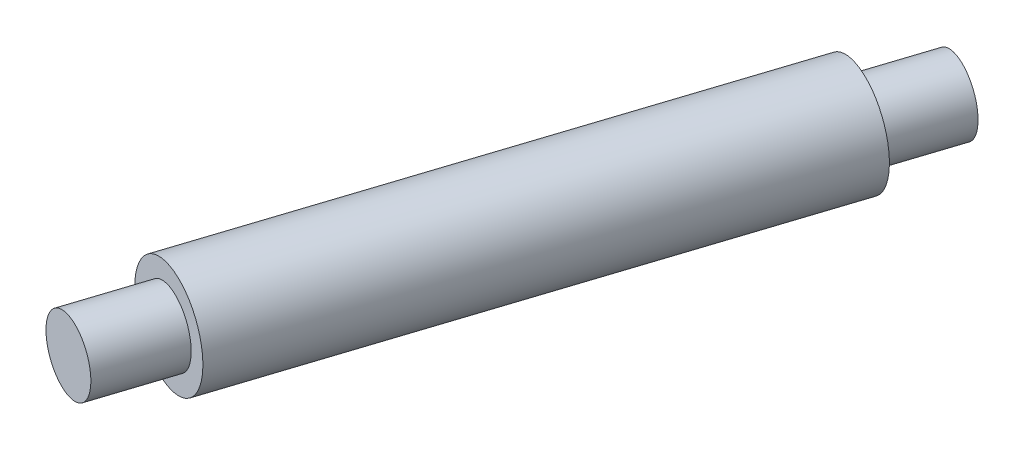
ISO-10303-21;
HEADER;
FILE_DESCRIPTION(('STEP AP214'),'2;1');
FILE_NAME('part.step','',(''),(''),'','','');
FILE_SCHEMA(('AUTOMOTIVE_DESIGN { 1 0 10303 214 1 1 1 1 }'));
ENDSEC;
DATA;
#1=APPLICATION_CONTEXT('core data for automotive mechanical design processes');
#2=APPLICATION_PROTOCOL_DEFINITION('international standard','automotive_design',2000,#1);
#3=PRODUCT_CONTEXT('',#1,'mechanical');
#4=PRODUCT('Part','Part','',(#3));
#5=PRODUCT_RELATED_PRODUCT_CATEGORY('part','',(#4));
#6=PRODUCT_DEFINITION_FORMATION('','',#4);
#7=PRODUCT_DEFINITION_CONTEXT('part definition',#1,'design');
#8=PRODUCT_DEFINITION('design','',#6,#7);
#9=PRODUCT_DEFINITION_SHAPE('','',#8);
#10=(LENGTH_UNIT() NAMED_UNIT(*) SI_UNIT(.MILLI.,.METRE.));
#11=(NAMED_UNIT(*) PLANE_ANGLE_UNIT() SI_UNIT($,.RADIAN.));
#12=(NAMED_UNIT(*) SI_UNIT($,.STERADIAN.) SOLID_ANGLE_UNIT());
#13=UNCERTAINTY_MEASURE_WITH_UNIT(LENGTH_MEASURE(1.E-05),#10,'distance_accuracy_value','');
#14=(GEOMETRIC_REPRESENTATION_CONTEXT(3) GLOBAL_UNCERTAINTY_ASSIGNED_CONTEXT((#13)) GLOBAL_UNIT_ASSIGNED_CONTEXT((#10,
#11,#12)) REPRESENTATION_CONTEXT('',''));
#15=CARTESIAN_POINT('',(0.,0.,0.));
#16=DIRECTION('',(0.,0.,1.));
#17=DIRECTION('',(1.,0.,0.));
#18=AXIS2_PLACEMENT_3D('',#15,#16,#17);
#19=CARTESIAN_POINT('',(-26.59443763107,7.802709104713,4.502221206407));
#20=DIRECTION('',(0.309016994374702,0.,-0.951056516295233));
#21=DIRECTION('',(0.951056516295233,0.,0.309016994374702));
#22=AXIS2_PLACEMENT_3D('',#19,#20,#21);
#23=PLANE('',#22);
#24=CARTESIAN_POINT('',(-25.3580641598791,6.5,4.90394329908783));
#25=DIRECTION('',(0.309016994379564,0.,-0.951056516293654));
#26=DIRECTION('',(-0.951056516293654,0.,-0.309016994379564));
#27=AXIS2_PLACEMENT_3D('',#24,#25,#26);
#28=CIRCLE('',#27,1.24999999999118);
#29=CARTESIAN_POINT('',(-26.5468848052378,6.5,4.5176720561161));
#30=VERTEX_POINT('',#29);
#31=EDGE_CURVE('E19',#30,#30,#28,.F.);
#32=ORIENTED_EDGE('',*,*,#31,.T.);
#33=EDGE_LOOP('',(#32));
#34=FACE_BOUND('',#33,.T.);
#35=ADVANCED_FACE('F15',(#34),#23,.F.);
#36=CARTESIAN_POINT('',(-25.3580641598791,6.5,4.90394329908783));
#37=DIRECTION('',(0.309016994379564,0.,-0.951056516293654));
#38=DIRECTION('',(-0.951056516293654,0.,-0.309016994379564));
#39=AXIS2_PLACEMENT_3D('',#36,#37,#38);
#40=CYLINDRICAL_SURFACE('',#39,1.24999999999118);
#41=CARTESIAN_POINT('',(-24.4773657259011,6.5,2.19343222766236));
#42=DIRECTION('',(0.309016994379564,0.,-0.951056516293654));
#43=DIRECTION('',(-0.951056516293654,0.,-0.309016994379564));
#44=AXIS2_PLACEMENT_3D('',#41,#42,#43);
#45=CIRCLE('',#44,1.24999999999118);
#46=CARTESIAN_POINT('',(-25.6661863712597,6.5,1.80716098469063));
#47=VERTEX_POINT('',#46);
#48=EDGE_CURVE('E35',#47,#47,#45,.F.);
#49=ORIENTED_EDGE('',*,*,#48,.T.);
#50=EDGE_LOOP('',(#49));
#51=FACE_BOUND('',#50,.T.);
#52=ORIENTED_EDGE('',*,*,#31,.F.);
#53=EDGE_LOOP('',(#52));
#54=FACE_BOUND('',#53,.T.);
#55=ADVANCED_FACE('F43',(#51,#54),#40,.T.);
#56=CARTESIAN_POINT('',(-26.35665340211,8.479131998468,1.582814646768));
#57=DIRECTION('',(0.309016994375623,0.,-0.951056516294934));
#58=DIRECTION('',(0.951056516294934,0.,0.309016994375623));
#59=AXIS2_PLACEMENT_3D('',#56,#57,#58);
#60=PLANE('',#59);
#61=ORIENTED_EDGE('',*,*,#48,.F.);
#62=EDGE_LOOP('',(#61));
#63=FACE_BOUND('',#62,.T.);
#64=CARTESIAN_POINT('',(-24.4773657258963,6.5,2.19343222764764));
#65=DIRECTION('',(0.309016994379565,0.,-0.951056516293654));
#66=DIRECTION('',(-0.951056516293654,0.,-0.309016994379565));
#67=AXIS2_PLACEMENT_3D('',#64,#65,#66);
#68=CIRCLE('',#67,1.89999999993594);
#69=CARTESIAN_POINT('',(-26.2843731067933,6.5,1.60629993834626));
#70=VERTEX_POINT('',#69);
#71=EDGE_CURVE('E33',#70,#70,#68,.F.);
#72=ORIENTED_EDGE('',*,*,#71,.T.);
#73=EDGE_LOOP('',(#72));
#74=FACE_BOUND('',#73,.T.);
#75=ADVANCED_FACE('F45',(#63,#74),#60,.F.);
#76=CARTESIAN_POINT('',(-24.4773657258963,6.5,2.19343222764764));
#77=DIRECTION('',(0.309016994379565,0.,-0.951056516293654));
#78=DIRECTION('',(-0.951056516293654,0.,-0.309016994379565));
#79=AXIS2_PLACEMENT_3D('',#76,#77,#78);
#80=CYLINDRICAL_SURFACE('',#79,1.89999999993594);
#81=CARTESIAN_POINT('',(-18.4515343355014,6.50000000000001,-16.3521698400582));
#82=DIRECTION('',(0.309016994379565,0.,-0.951056516293654));
#83=DIRECTION('',(-0.951056516293654,0.,-0.309016994379565));
#84=AXIS2_PLACEMENT_3D('',#81,#82,#83);
#85=CIRCLE('',#84,1.89999999993594);
#86=CARTESIAN_POINT('',(-20.2585417163984,6.50000000000001,-16.9393021293595));
#87=VERTEX_POINT('',#86);
#88=EDGE_CURVE('E28',#87,#87,#85,.F.);
#89=ORIENTED_EDGE('',*,*,#88,.T.);
#90=EDGE_LOOP('',(#89));
#91=FACE_BOUND('',#90,.T.);
#92=ORIENTED_EDGE('',*,*,#71,.F.);
#93=EDGE_LOOP('',(#92));
#94=FACE_BOUND('',#93,.T.);
#95=ADVANCED_FACE('F52',(#91,#94),#80,.T.);
#96=CARTESIAN_POINT('',(-20.3308220118,8.479131998468,-16.96278742099));
#97=DIRECTION('',(0.309016994374879,0.,-0.951056516295176));
#98=DIRECTION('',(0.951056516295176,0.,0.309016994374879));
#99=AXIS2_PLACEMENT_3D('',#96,#97,#98);
#100=PLANE('',#99);
#101=CARTESIAN_POINT('',(-18.4515343354966,6.5,-16.3521698400729));
#102=DIRECTION('',(0.309016994379569,0.,-0.951056516293652));
#103=DIRECTION('',(-0.951056516293652,0.,-0.309016994379569));
#104=AXIS2_PLACEMENT_3D('',#101,#102,#103);
#105=CIRCLE('',#104,1.2499999998839);
#106=CARTESIAN_POINT('',(-19.6403549807533,6.5,-16.7384410830115));
#107=VERTEX_POINT('',#106);
#108=EDGE_CURVE('E23',#107,#107,#105,.F.);
#109=ORIENTED_EDGE('',*,*,#108,.T.);
#110=EDGE_LOOP('',(#109));
#111=FACE_BOUND('',#110,.T.);
#112=ORIENTED_EDGE('',*,*,#88,.F.);
#113=EDGE_LOOP('',(#112));
#114=FACE_BOUND('',#113,.T.);
#115=ADVANCED_FACE('F63',(#111,#114),#100,.T.);
#116=CARTESIAN_POINT('',(-18.4515343354966,6.5,-16.3521698400729));
#117=DIRECTION('',(0.309016994379569,0.,-0.951056516293652));
#118=DIRECTION('',(-0.951056516293652,0.,-0.309016994379569));
#119=AXIS2_PLACEMENT_3D('',#116,#117,#118);
#120=CYLINDRICAL_SURFACE('',#119,1.2499999998839);
#121=CARTESIAN_POINT('',(-17.5708359015151,6.5,-19.0626809115091));
#122=DIRECTION('',(0.309016994379568,0.,-0.951056516293653));
#123=DIRECTION('',(-0.951056516293653,0.,-0.309016994379568));
#124=AXIS2_PLACEMENT_3D('',#121,#122,#123);
#125=CIRCLE('',#124,1.24999999988391);
#126=CARTESIAN_POINT('',(-18.7596565467717,6.5,-19.4489521544477));
#127=VERTEX_POINT('',#126);
#128=EDGE_CURVE('E10',#127,#127,#125,.F.);
#129=ORIENTED_EDGE('',*,*,#128,.T.);
#130=EDGE_LOOP('',(#129));
#131=FACE_BOUND('',#130,.T.);
#132=ORIENTED_EDGE('',*,*,#108,.F.);
#133=EDGE_LOOP('',(#132));
#134=FACE_BOUND('',#133,.T.);
#135=ADVANCED_FACE('F58',(#131,#134),#120,.T.);
#136=CARTESIAN_POINT('',(-18.80720937282,7.802709104713,-19.46440300423));
#137=DIRECTION('',(0.30901699437296,0.,-0.951056516295799));
#138=DIRECTION('',(0.951056516295799,0.,0.30901699437296));
#139=AXIS2_PLACEMENT_3D('',#136,#137,#138);
#140=PLANE('',#139);
#141=ORIENTED_EDGE('',*,*,#128,.F.);
#142=EDGE_LOOP('',(#141));
#143=FACE_BOUND('',#142,.T.);
#144=ADVANCED_FACE('F17',(#143),#140,.T.);
#145=CLOSED_SHELL('',(#35,#55,#75,#95,#115,#135,#144));
#146=MANIFOLD_SOLID_BREP('B1',#145);
#147=ADVANCED_BREP_SHAPE_REPRESENTATION('',(#18,#146),#14);
#148=SHAPE_DEFINITION_REPRESENTATION(#9,#147);
ENDSEC;
END-ISO-10303-21;
